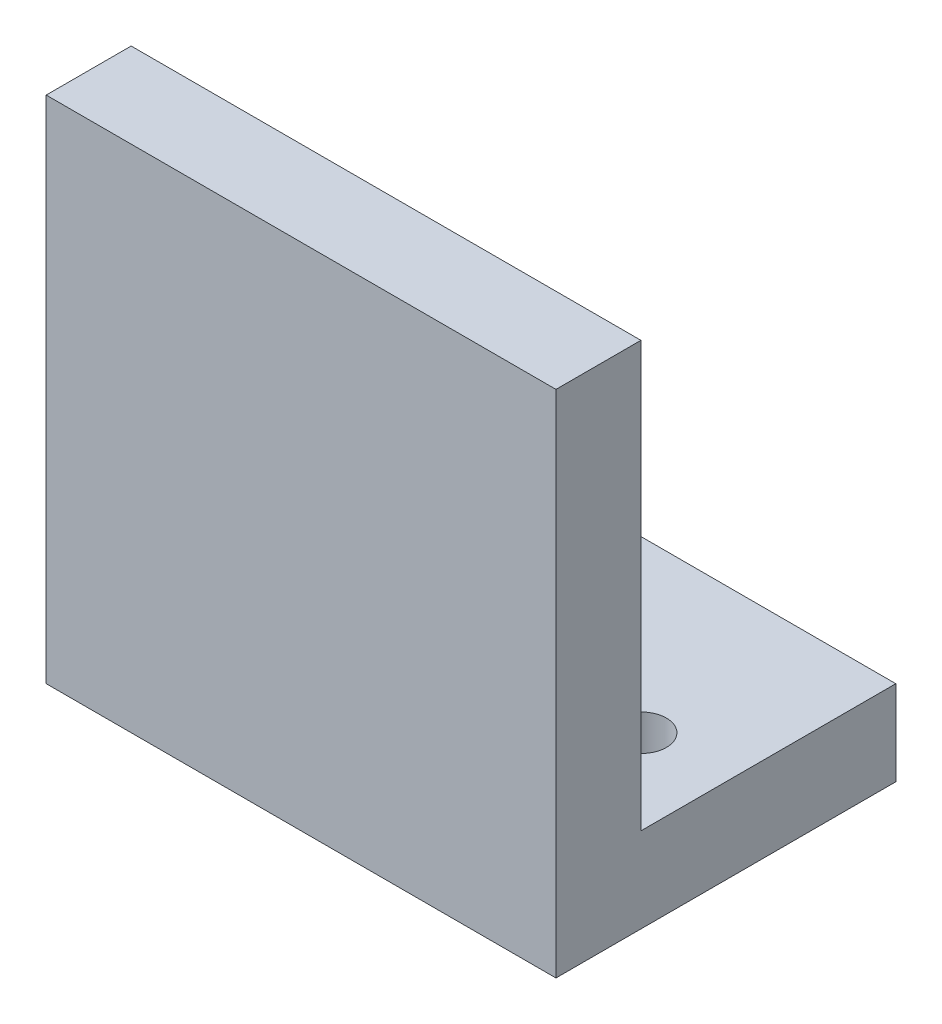
ISO-10303-21;
HEADER;
FILE_DESCRIPTION(('STEP AP214'),'2;1');
FILE_NAME('part.step','',(''),(''),'','','');
FILE_SCHEMA(('AUTOMOTIVE_DESIGN { 1 0 10303 214 1 1 1 1 }'));
ENDSEC;
DATA;
#1=APPLICATION_CONTEXT('core data for automotive mechanical design processes');
#2=APPLICATION_PROTOCOL_DEFINITION('international standard','automotive_design',2000,#1);
#3=PRODUCT_CONTEXT('',#1,'mechanical');
#4=PRODUCT('Part','Part','',(#3));
#5=PRODUCT_RELATED_PRODUCT_CATEGORY('part','',(#4));
#6=PRODUCT_DEFINITION_FORMATION('','',#4);
#7=PRODUCT_DEFINITION_CONTEXT('part definition',#1,'design');
#8=PRODUCT_DEFINITION('design','',#6,#7);
#9=PRODUCT_DEFINITION_SHAPE('','',#8);
#10=(LENGTH_UNIT() NAMED_UNIT(*) SI_UNIT(.MILLI.,.METRE.));
#11=(NAMED_UNIT(*) PLANE_ANGLE_UNIT() SI_UNIT($,.RADIAN.));
#12=(NAMED_UNIT(*) SI_UNIT($,.STERADIAN.) SOLID_ANGLE_UNIT());
#13=UNCERTAINTY_MEASURE_WITH_UNIT(LENGTH_MEASURE(1.E-05),#10,'distance_accuracy_value','');
#14=(GEOMETRIC_REPRESENTATION_CONTEXT(3) GLOBAL_UNCERTAINTY_ASSIGNED_CONTEXT((#13)) GLOBAL_UNIT_ASSIGNED_CONTEXT((#10,
#11,#12)) REPRESENTATION_CONTEXT('',''));
#15=CARTESIAN_POINT('',(0.,0.,0.));
#16=DIRECTION('',(0.,0.,1.));
#17=DIRECTION('',(1.,0.,0.));
#18=AXIS2_PLACEMENT_3D('',#15,#16,#17);
#19=CARTESIAN_POINT('',(30.,25.,5.));
#20=DIRECTION('',(0.,-1.,0.));
#21=DIRECTION('',(0.,0.,-1.));
#22=AXIS2_PLACEMENT_3D('',#19,#20,#21);
#23=PLANE('',#22);
#24=DIRECTION('',(0.,0.,1.));
#25=VECTOR('',#24,1.);
#26=CARTESIAN_POINT('',(0.,25.,5.));
#27=LINE('',#26,#25);
#28=CARTESIAN_POINT('',(0.,25.,0.));
#29=VERTEX_POINT('',#28);
#30=CARTESIAN_POINT('',(0.,25.,5.));
#31=VERTEX_POINT('',#30);
#32=EDGE_CURVE('E118',#29,#31,#27,.T.);
#33=ORIENTED_EDGE('',*,*,#32,.T.);
#34=DIRECTION('',(-1.,0.,0.));
#35=VECTOR('',#34,1.);
#36=CARTESIAN_POINT('',(30.,25.,5.));
#37=LINE('',#36,#35);
#38=CARTESIAN_POINT('',(30.,25.,5.));
#39=VERTEX_POINT('',#38);
#40=EDGE_CURVE('E11',#39,#31,#37,.T.);
#41=ORIENTED_EDGE('',*,*,#40,.F.);
#42=DIRECTION('',(0.,0.,1.));
#43=VECTOR('',#42,1.);
#44=CARTESIAN_POINT('',(30.,25.,5.));
#45=LINE('',#44,#43);
#46=CARTESIAN_POINT('',(30.,25.,0.));
#47=VERTEX_POINT('',#46);
#48=EDGE_CURVE('E129',#47,#39,#45,.T.);
#49=ORIENTED_EDGE('',*,*,#48,.F.);
#50=DIRECTION('',(-1.,0.,0.));
#51=VECTOR('',#50,1.);
#52=CARTESIAN_POINT('',(30.,25.,0.));
#53=LINE('',#52,#51);
#54=EDGE_CURVE('E114',#47,#29,#53,.T.);
#55=ORIENTED_EDGE('',*,*,#54,.T.);
#56=EDGE_LOOP('',(#33,#41,#49,#55));
#57=FACE_BOUND('',#56,.T.);
#58=ADVANCED_FACE('F34',(#57),#23,.F.);
#59=CARTESIAN_POINT('',(30.,-5.,5.));
#60=DIRECTION('',(0.,0.,-1.));
#61=DIRECTION('',(0.,1.,0.));
#62=AXIS2_PLACEMENT_3D('',#59,#60,#61);
#63=PLANE('',#62);
#64=DIRECTION('',(0.,-1.,0.));
#65=VECTOR('',#64,1.);
#66=CARTESIAN_POINT('',(0.,-5.,5.));
#67=LINE('',#66,#65);
#68=CARTESIAN_POINT('',(0.,-5.,5.));
#69=VERTEX_POINT('',#68);
#70=EDGE_CURVE('E121',#31,#69,#67,.T.);
#71=ORIENTED_EDGE('',*,*,#70,.T.);
#72=DIRECTION('',(-1.,0.,0.));
#73=VECTOR('',#72,1.);
#74=CARTESIAN_POINT('',(30.,-5.,5.));
#75=LINE('',#74,#73);
#76=CARTESIAN_POINT('',(30.,-5.,5.));
#77=VERTEX_POINT('',#76);
#78=EDGE_CURVE('E42',#77,#69,#75,.T.);
#79=ORIENTED_EDGE('',*,*,#78,.F.);
#80=DIRECTION('',(0.,-1.,0.));
#81=VECTOR('',#80,1.);
#82=CARTESIAN_POINT('',(30.,-5.,5.));
#83=LINE('',#82,#81);
#84=EDGE_CURVE('E87',#39,#77,#83,.T.);
#85=ORIENTED_EDGE('',*,*,#84,.F.);
#86=ORIENTED_EDGE('',*,*,#40,.T.);
#87=EDGE_LOOP('',(#71,#79,#85,#86));
#88=FACE_BOUND('',#87,.T.);
#89=ADVANCED_FACE('F154',(#88),#63,.F.);
#90=CARTESIAN_POINT('',(30.,-5.,-15.));
#91=DIRECTION('',(0.,1.,0.));
#92=DIRECTION('',(0.,0.,1.));
#93=AXIS2_PLACEMENT_3D('',#90,#91,#92);
#94=PLANE('',#93);
#95=CARTESIAN_POINT('',(5.,-5.,-5.));
#96=DIRECTION('',(0.,1.,0.));
#97=DIRECTION('',(0.,0.,1.));
#98=AXIS2_PLACEMENT_3D('',#95,#96,#97);
#99=CIRCLE('',#98,1.5);
#100=CARTESIAN_POINT('',(5.,-5.,-3.5));
#101=VERTEX_POINT('',#100);
#102=EDGE_CURVE('E122',#101,#101,#99,.T.);
#103=ORIENTED_EDGE('',*,*,#102,.T.);
#104=EDGE_LOOP('',(#103));
#105=FACE_BOUND('',#104,.T.);
#106=CARTESIAN_POINT('',(25.,-5.,-5.));
#107=DIRECTION('',(0.,1.,0.));
#108=DIRECTION('',(0.,0.,1.));
#109=AXIS2_PLACEMENT_3D('',#106,#107,#108);
#110=CIRCLE('',#109,1.5);
#111=CARTESIAN_POINT('',(25.,-5.,-3.5));
#112=VERTEX_POINT('',#111);
#113=EDGE_CURVE('E222',#112,#112,#110,.T.);
#114=ORIENTED_EDGE('',*,*,#113,.T.);
#115=EDGE_LOOP('',(#114));
#116=FACE_BOUND('',#115,.T.);
#117=DIRECTION('',(0.,0.,-1.));
#118=VECTOR('',#117,1.);
#119=CARTESIAN_POINT('',(0.,-5.,-15.));
#120=LINE('',#119,#118);
#121=CARTESIAN_POINT('',(0.,-5.,-15.));
#122=VERTEX_POINT('',#121);
#123=EDGE_CURVE('E124',#69,#122,#120,.T.);
#124=ORIENTED_EDGE('',*,*,#123,.T.);
#125=DIRECTION('',(-1.,0.,0.));
#126=VECTOR('',#125,1.);
#127=CARTESIAN_POINT('',(30.,-5.,-15.));
#128=LINE('',#127,#126);
#129=CARTESIAN_POINT('',(30.,-5.,-15.));
#130=VERTEX_POINT('',#129);
#131=EDGE_CURVE('E109',#130,#122,#128,.T.);
#132=ORIENTED_EDGE('',*,*,#131,.F.);
#133=DIRECTION('',(0.,0.,-1.));
#134=VECTOR('',#133,1.);
#135=CARTESIAN_POINT('',(30.,-5.,-15.));
#136=LINE('',#135,#134);
#137=EDGE_CURVE('E100',#77,#130,#136,.T.);
#138=ORIENTED_EDGE('',*,*,#137,.F.);
#139=ORIENTED_EDGE('',*,*,#78,.T.);
#140=EDGE_LOOP('',(#124,#132,#138,#139));
#141=FACE_BOUND('',#140,.T.);
#142=ADVANCED_FACE('F135',(#105,#116,#141),#94,.F.);
#143=CARTESIAN_POINT('',(30.,0.,-15.));
#144=DIRECTION('',(0.,0.,1.));
#145=DIRECTION('',(0.,-1.,0.));
#146=AXIS2_PLACEMENT_3D('',#143,#144,#145);
#147=PLANE('',#146);
#148=DIRECTION('',(0.,1.,0.));
#149=VECTOR('',#148,1.);
#150=CARTESIAN_POINT('',(0.,0.,-15.));
#151=LINE('',#150,#149);
#152=CARTESIAN_POINT('',(0.,0.,-15.));
#153=VERTEX_POINT('',#152);
#154=EDGE_CURVE('E108',#122,#153,#151,.T.);
#155=ORIENTED_EDGE('',*,*,#154,.T.);
#156=DIRECTION('',(-1.,0.,0.));
#157=VECTOR('',#156,1.);
#158=CARTESIAN_POINT('',(30.,0.,-15.));
#159=LINE('',#158,#157);
#160=CARTESIAN_POINT('',(30.,0.,-15.));
#161=VERTEX_POINT('',#160);
#162=EDGE_CURVE('E105',#161,#153,#159,.T.);
#163=ORIENTED_EDGE('',*,*,#162,.F.);
#164=DIRECTION('',(0.,1.,0.));
#165=VECTOR('',#164,1.);
#166=CARTESIAN_POINT('',(30.,0.,-15.));
#167=LINE('',#166,#165);
#168=EDGE_CURVE('E94',#130,#161,#167,.T.);
#169=ORIENTED_EDGE('',*,*,#168,.F.);
#170=ORIENTED_EDGE('',*,*,#131,.T.);
#171=EDGE_LOOP('',(#155,#163,#169,#170));
#172=FACE_BOUND('',#171,.T.);
#173=ADVANCED_FACE('F106',(#172),#147,.F.);
#174=CARTESIAN_POINT('',(30.,0.,0.));
#175=DIRECTION('',(0.,-1.,0.));
#176=DIRECTION('',(0.,0.,-1.));
#177=AXIS2_PLACEMENT_3D('',#174,#175,#176);
#178=PLANE('',#177);
#179=CARTESIAN_POINT('',(5.,0.,-5.));
#180=DIRECTION('',(0.,1.,0.));
#181=DIRECTION('',(0.,0.,1.));
#182=AXIS2_PLACEMENT_3D('',#179,#180,#181);
#183=CIRCLE('',#182,1.5);
#184=CARTESIAN_POINT('',(5.,0.,-3.5));
#185=VERTEX_POINT('',#184);
#186=EDGE_CURVE('E219',#185,#185,#183,.T.);
#187=ORIENTED_EDGE('',*,*,#186,.F.);
#188=EDGE_LOOP('',(#187));
#189=FACE_BOUND('',#188,.T.);
#190=CARTESIAN_POINT('',(25.,0.,-5.));
#191=DIRECTION('',(0.,1.,0.));
#192=DIRECTION('',(0.,0.,1.));
#193=AXIS2_PLACEMENT_3D('',#190,#191,#192);
#194=CIRCLE('',#193,1.5);
#195=CARTESIAN_POINT('',(25.,0.,-3.5));
#196=VERTEX_POINT('',#195);
#197=EDGE_CURVE('E229',#196,#196,#194,.T.);
#198=ORIENTED_EDGE('',*,*,#197,.F.);
#199=EDGE_LOOP('',(#198));
#200=FACE_BOUND('',#199,.T.);
#201=DIRECTION('',(0.,0.,1.));
#202=VECTOR('',#201,1.);
#203=CARTESIAN_POINT('',(0.,0.,0.));
#204=LINE('',#203,#202);
#205=CARTESIAN_POINT('',(0.,0.,0.));
#206=VERTEX_POINT('',#205);
#207=EDGE_CURVE('E73',#153,#206,#204,.T.);
#208=ORIENTED_EDGE('',*,*,#207,.T.);
#209=DIRECTION('',(-1.,0.,0.));
#210=VECTOR('',#209,1.);
#211=CARTESIAN_POINT('',(30.,0.,0.));
#212=LINE('',#211,#210);
#213=CARTESIAN_POINT('',(30.,0.,0.));
#214=VERTEX_POINT('',#213);
#215=EDGE_CURVE('E110',#214,#206,#212,.T.);
#216=ORIENTED_EDGE('',*,*,#215,.F.);
#217=DIRECTION('',(0.,0.,1.));
#218=VECTOR('',#217,1.);
#219=CARTESIAN_POINT('',(30.,0.,0.));
#220=LINE('',#219,#218);
#221=EDGE_CURVE('E98',#161,#214,#220,.T.);
#222=ORIENTED_EDGE('',*,*,#221,.F.);
#223=ORIENTED_EDGE('',*,*,#162,.T.);
#224=EDGE_LOOP('',(#208,#216,#222,#223));
#225=FACE_BOUND('',#224,.T.);
#226=ADVANCED_FACE('F112',(#189,#200,#225),#178,.F.);
#227=CARTESIAN_POINT('',(30.,25.,0.));
#228=DIRECTION('',(0.,0.,1.));
#229=DIRECTION('',(1.,0.,0.));
#230=AXIS2_PLACEMENT_3D('',#227,#228,#229);
#231=PLANE('',#230);
#232=DIRECTION('',(0.,1.,0.));
#233=VECTOR('',#232,1.);
#234=CARTESIAN_POINT('',(0.,25.,0.));
#235=LINE('',#234,#233);
#236=EDGE_CURVE('E79',#206,#29,#235,.T.);
#237=ORIENTED_EDGE('',*,*,#236,.T.);
#238=ORIENTED_EDGE('',*,*,#54,.F.);
#239=DIRECTION('',(0.,1.,0.));
#240=VECTOR('',#239,1.);
#241=CARTESIAN_POINT('',(30.,25.,0.));
#242=LINE('',#241,#240);
#243=EDGE_CURVE('E50',#214,#47,#242,.T.);
#244=ORIENTED_EDGE('',*,*,#243,.F.);
#245=ORIENTED_EDGE('',*,*,#215,.T.);
#246=EDGE_LOOP('',(#237,#238,#244,#245));
#247=FACE_BOUND('',#246,.T.);
#248=ADVANCED_FACE('F142',(#247),#231,.F.);
#249=CARTESIAN_POINT('',(30.,0.,0.));
#250=DIRECTION('',(-1.,0.,0.));
#251=DIRECTION('',(0.,0.,1.));
#252=AXIS2_PLACEMENT_3D('',#249,#250,#251);
#253=PLANE('',#252);
#254=ORIENTED_EDGE('',*,*,#48,.T.);
#255=ORIENTED_EDGE('',*,*,#84,.T.);
#256=ORIENTED_EDGE('',*,*,#137,.T.);
#257=ORIENTED_EDGE('',*,*,#168,.T.);
#258=ORIENTED_EDGE('',*,*,#221,.T.);
#259=ORIENTED_EDGE('',*,*,#243,.T.);
#260=EDGE_LOOP('',(#254,#255,#256,#257,#258,#259));
#261=FACE_BOUND('',#260,.T.);
#262=ADVANCED_FACE('F96',(#261),#253,.F.);
#263=CARTESIAN_POINT('',(0.,0.,0.));
#264=DIRECTION('',(-1.,0.,0.));
#265=DIRECTION('',(0.,0.,1.));
#266=AXIS2_PLACEMENT_3D('',#263,#264,#265);
#267=PLANE('',#266);
#268=ORIENTED_EDGE('',*,*,#32,.F.);
#269=ORIENTED_EDGE('',*,*,#236,.F.);
#270=ORIENTED_EDGE('',*,*,#207,.F.);
#271=ORIENTED_EDGE('',*,*,#154,.F.);
#272=ORIENTED_EDGE('',*,*,#123,.F.);
#273=ORIENTED_EDGE('',*,*,#70,.F.);
#274=EDGE_LOOP('',(#268,#269,#270,#271,#272,#273));
#275=FACE_BOUND('',#274,.T.);
#276=ADVANCED_FACE('F138',(#275),#267,.T.);
#277=CARTESIAN_POINT('',(25.,-20.,-5.));
#278=DIRECTION('',(0.,1.,0.));
#279=DIRECTION('',(0.,0.,1.));
#280=AXIS2_PLACEMENT_3D('',#277,#278,#279);
#281=CYLINDRICAL_SURFACE('',#280,1.5);
#282=ORIENTED_EDGE('',*,*,#197,.T.);
#283=EDGE_LOOP('',(#282));
#284=FACE_BOUND('',#283,.T.);
#285=ORIENTED_EDGE('',*,*,#113,.F.);
#286=EDGE_LOOP('',(#285));
#287=FACE_BOUND('',#286,.T.);
#288=ADVANCED_FACE('F182',(#284,#287),#281,.F.);
#289=CARTESIAN_POINT('',(5.,-20.,-5.));
#290=DIRECTION('',(0.,1.,0.));
#291=DIRECTION('',(0.,0.,1.));
#292=AXIS2_PLACEMENT_3D('',#289,#290,#291);
#293=CYLINDRICAL_SURFACE('',#292,1.5);
#294=ORIENTED_EDGE('',*,*,#186,.T.);
#295=EDGE_LOOP('',(#294));
#296=FACE_BOUND('',#295,.T.);
#297=ORIENTED_EDGE('',*,*,#102,.F.);
#298=EDGE_LOOP('',(#297));
#299=FACE_BOUND('',#298,.T.);
#300=ADVANCED_FACE('F187',(#296,#299),#293,.F.);
#301=CLOSED_SHELL('',(#58,#89,#142,#173,#226,#248,#262,#276,#288,#300));
#302=MANIFOLD_SOLID_BREP('B2',#301);
#303=ADVANCED_BREP_SHAPE_REPRESENTATION('',(#18,#302),#14);
#304=SHAPE_DEFINITION_REPRESENTATION(#9,#303);
ENDSEC;
END-ISO-10303-21;
